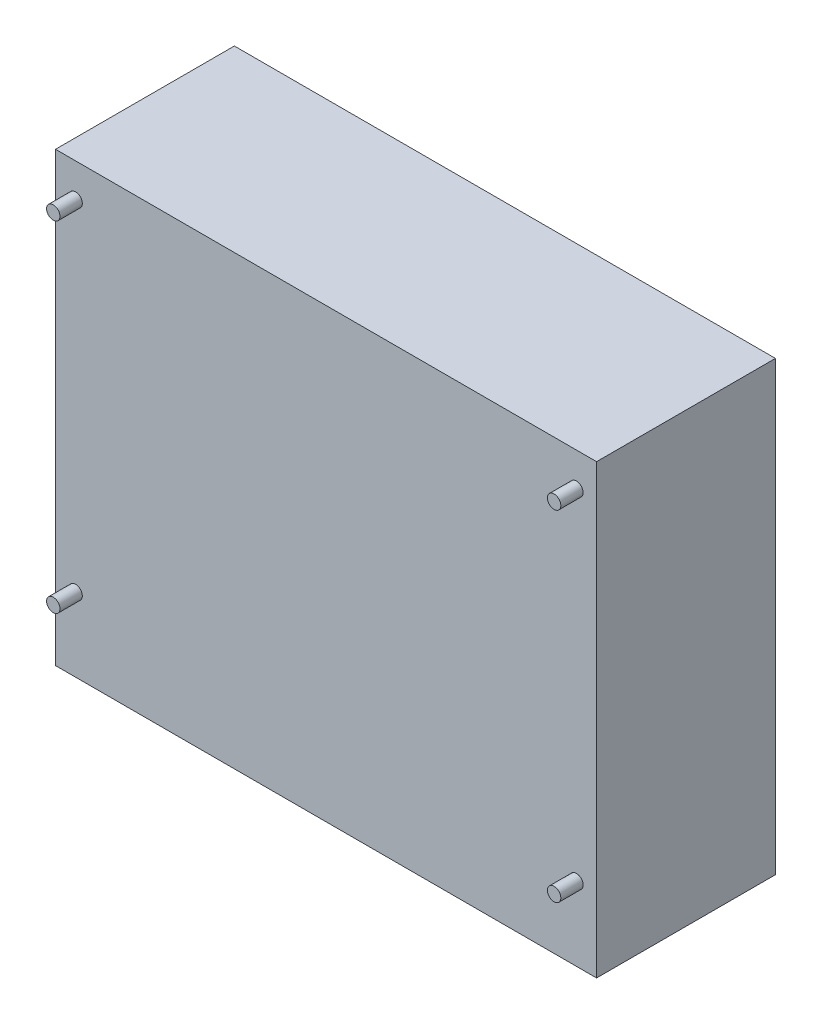
ISO-10303-21;
HEADER;
FILE_DESCRIPTION(('STEP AP214'),'2;1');
FILE_NAME('part.step','',(''),(''),'','','');
FILE_SCHEMA(('AUTOMOTIVE_DESIGN { 1 0 10303 214 1 1 1 1 }'));
ENDSEC;
DATA;
#1=APPLICATION_CONTEXT('core data for automotive mechanical design processes');
#2=APPLICATION_PROTOCOL_DEFINITION('international standard','automotive_design',2000,#1);
#3=PRODUCT_CONTEXT('',#1,'mechanical');
#4=PRODUCT('Part','Part','',(#3));
#5=PRODUCT_RELATED_PRODUCT_CATEGORY('part','',(#4));
#6=PRODUCT_DEFINITION_FORMATION('','',#4);
#7=PRODUCT_DEFINITION_CONTEXT('part definition',#1,'design');
#8=PRODUCT_DEFINITION('design','',#6,#7);
#9=PRODUCT_DEFINITION_SHAPE('','',#8);
#10=(LENGTH_UNIT() NAMED_UNIT(*) SI_UNIT(.MILLI.,.METRE.));
#11=(NAMED_UNIT(*) PLANE_ANGLE_UNIT() SI_UNIT($,.RADIAN.));
#12=(NAMED_UNIT(*) SI_UNIT($,.STERADIAN.) SOLID_ANGLE_UNIT());
#13=UNCERTAINTY_MEASURE_WITH_UNIT(LENGTH_MEASURE(1.E-05),#10,'distance_accuracy_value','');
#14=(GEOMETRIC_REPRESENTATION_CONTEXT(3) GLOBAL_UNCERTAINTY_ASSIGNED_CONTEXT((#13)) GLOBAL_UNIT_ASSIGNED_CONTEXT((#10,
#11,#12)) REPRESENTATION_CONTEXT('',''));
#15=CARTESIAN_POINT('',(0.,0.,0.));
#16=DIRECTION('',(0.,0.,1.));
#17=DIRECTION('',(1.,0.,0.));
#18=AXIS2_PLACEMENT_3D('',#15,#16,#17);
#19=CARTESIAN_POINT('',(0.,0.,40.));
#20=DIRECTION('',(-1.,0.,0.));
#21=DIRECTION('',(0.,0.,1.));
#22=AXIS2_PLACEMENT_3D('',#19,#20,#21);
#23=PLANE('',#22);
#24=DIRECTION('',(0.,1.,0.));
#25=VECTOR('',#24,1.);
#26=CARTESIAN_POINT('',(0.,0.,0.));
#27=LINE('',#26,#25);
#28=CARTESIAN_POINT('',(0.,0.,0.));
#29=VERTEX_POINT('',#28);
#30=CARTESIAN_POINT('',(0.,100.,0.));
#31=VERTEX_POINT('',#30);
#32=EDGE_CURVE('E168',#29,#31,#27,.T.);
#33=ORIENTED_EDGE('',*,*,#32,.T.);
#34=DIRECTION('',(0.,0.,-1.));
#35=VECTOR('',#34,1.);
#36=CARTESIAN_POINT('',(0.,100.,40.));
#37=LINE('',#36,#35);
#38=CARTESIAN_POINT('',(0.,100.,40.));
#39=VERTEX_POINT('',#38);
#40=EDGE_CURVE('E12',#39,#31,#37,.T.);
#41=ORIENTED_EDGE('',*,*,#40,.F.);
#42=DIRECTION('',(0.,1.,0.));
#43=VECTOR('',#42,1.);
#44=CARTESIAN_POINT('',(0.,0.,40.));
#45=LINE('',#44,#43);
#46=CARTESIAN_POINT('',(0.,0.,40.));
#47=VERTEX_POINT('',#46);
#48=EDGE_CURVE('E171',#47,#39,#45,.T.);
#49=ORIENTED_EDGE('',*,*,#48,.F.);
#50=DIRECTION('',(0.,0.,-1.));
#51=VECTOR('',#50,1.);
#52=CARTESIAN_POINT('',(0.,0.,40.));
#53=LINE('',#52,#51);
#54=EDGE_CURVE('E177',#47,#29,#53,.T.);
#55=ORIENTED_EDGE('',*,*,#54,.T.);
#56=EDGE_LOOP('',(#33,#41,#49,#55));
#57=FACE_BOUND('',#56,.T.);
#58=ADVANCED_FACE('F42',(#57),#23,.F.);
#59=CARTESIAN_POINT('',(0.,100.,40.));
#60=DIRECTION('',(0.,-1.,0.));
#61=DIRECTION('',(1.,0.,0.));
#62=AXIS2_PLACEMENT_3D('',#59,#60,#61);
#63=PLANE('',#62);
#64=DIRECTION('',(-1.,0.,0.));
#65=VECTOR('',#64,1.);
#66=CARTESIAN_POINT('',(0.,100.,0.));
#67=LINE('',#66,#65);
#68=CARTESIAN_POINT('',(-121.,100.,0.));
#69=VERTEX_POINT('',#68);
#70=EDGE_CURVE('E180',#31,#69,#67,.T.);
#71=ORIENTED_EDGE('',*,*,#70,.T.);
#72=DIRECTION('',(0.,0.,-1.));
#73=VECTOR('',#72,1.);
#74=CARTESIAN_POINT('',(-121.,100.,40.));
#75=LINE('',#74,#73);
#76=CARTESIAN_POINT('',(-121.,100.,40.));
#77=VERTEX_POINT('',#76);
#78=EDGE_CURVE('E50',#77,#69,#75,.T.);
#79=ORIENTED_EDGE('',*,*,#78,.F.);
#80=DIRECTION('',(-1.,0.,0.));
#81=VECTOR('',#80,1.);
#82=CARTESIAN_POINT('',(0.,100.,40.));
#83=LINE('',#82,#81);
#84=EDGE_CURVE('E94',#39,#77,#83,.T.);
#85=ORIENTED_EDGE('',*,*,#84,.F.);
#86=ORIENTED_EDGE('',*,*,#40,.T.);
#87=EDGE_LOOP('',(#71,#79,#85,#86));
#88=FACE_BOUND('',#87,.T.);
#89=ADVANCED_FACE('F209',(#88),#63,.F.);
#90=CARTESIAN_POINT('',(-121.,0.,40.));
#91=DIRECTION('',(1.,0.,0.));
#92=DIRECTION('',(0.,0.,-1.));
#93=AXIS2_PLACEMENT_3D('',#90,#91,#92);
#94=PLANE('',#93);
#95=DIRECTION('',(0.,-1.,0.));
#96=VECTOR('',#95,1.);
#97=CARTESIAN_POINT('',(-121.,0.,0.));
#98=LINE('',#97,#96);
#99=CARTESIAN_POINT('',(-121.,0.,0.));
#100=VERTEX_POINT('',#99);
#101=EDGE_CURVE('E182',#69,#100,#98,.T.);
#102=ORIENTED_EDGE('',*,*,#101,.T.);
#103=DIRECTION('',(0.,0.,-1.));
#104=VECTOR('',#103,1.);
#105=CARTESIAN_POINT('',(-121.,0.,40.));
#106=LINE('',#105,#104);
#107=CARTESIAN_POINT('',(-121.,0.,40.));
#108=VERTEX_POINT('',#107);
#109=EDGE_CURVE('E186',#108,#100,#106,.T.);
#110=ORIENTED_EDGE('',*,*,#109,.F.);
#111=DIRECTION('',(0.,-1.,0.));
#112=VECTOR('',#111,1.);
#113=CARTESIAN_POINT('',(-121.,0.,40.));
#114=LINE('',#113,#112);
#115=EDGE_CURVE('E174',#77,#108,#114,.T.);
#116=ORIENTED_EDGE('',*,*,#115,.F.);
#117=ORIENTED_EDGE('',*,*,#78,.T.);
#118=EDGE_LOOP('',(#102,#110,#116,#117));
#119=FACE_BOUND('',#118,.T.);
#120=ADVANCED_FACE('F191',(#119),#94,.F.);
#121=CARTESIAN_POINT('',(0.,0.,40.));
#122=DIRECTION('',(0.,1.,0.));
#123=DIRECTION('',(0.,0.,1.));
#124=AXIS2_PLACEMENT_3D('',#121,#122,#123);
#125=PLANE('',#124);
#126=DIRECTION('',(1.,0.,0.));
#127=VECTOR('',#126,1.);
#128=CARTESIAN_POINT('',(0.,0.,0.));
#129=LINE('',#128,#127);
#130=EDGE_CURVE('E87',#100,#29,#129,.T.);
#131=ORIENTED_EDGE('',*,*,#130,.T.);
#132=ORIENTED_EDGE('',*,*,#54,.F.);
#133=DIRECTION('',(1.,0.,0.));
#134=VECTOR('',#133,1.);
#135=CARTESIAN_POINT('',(0.,0.,40.));
#136=LINE('',#135,#134);
#137=EDGE_CURVE('E66',#108,#47,#136,.T.);
#138=ORIENTED_EDGE('',*,*,#137,.F.);
#139=ORIENTED_EDGE('',*,*,#109,.T.);
#140=EDGE_LOOP('',(#131,#132,#138,#139));
#141=FACE_BOUND('',#140,.T.);
#142=ADVANCED_FACE('F199',(#141),#125,.F.);
#143=CARTESIAN_POINT('',(0.,0.,40.));
#144=DIRECTION('',(0.,0.,1.));
#145=DIRECTION('',(1.,0.,0.));
#146=AXIS2_PLACEMENT_3D('',#143,#144,#145);
#147=PLANE('',#146);
#148=CARTESIAN_POINT('',(-4.49999999999999,16.5,40.));
#149=DIRECTION('',(0.,0.,1.));
#150=DIRECTION('',(1.,0.,0.));
#151=AXIS2_PLACEMENT_3D('',#148,#149,#150);
#152=CIRCLE('',#151,1.5);
#153=CARTESIAN_POINT('',(-2.99999999999999,16.5,40.));
#154=VERTEX_POINT('',#153);
#155=EDGE_CURVE('E147',#154,#154,#152,.T.);
#156=ORIENTED_EDGE('',*,*,#155,.F.);
#157=EDGE_LOOP('',(#156));
#158=FACE_BOUND('',#157,.T.);
#159=CARTESIAN_POINT('',(-116.5,16.5,40.));
#160=DIRECTION('',(0.,0.,1.));
#161=DIRECTION('',(1.,0.,0.));
#162=AXIS2_PLACEMENT_3D('',#159,#160,#161);
#163=CIRCLE('',#162,1.5);
#164=CARTESIAN_POINT('',(-115.,16.5,40.));
#165=VERTEX_POINT('',#164);
#166=EDGE_CURVE('E153',#165,#165,#163,.T.);
#167=ORIENTED_EDGE('',*,*,#166,.F.);
#168=EDGE_LOOP('',(#167));
#169=FACE_BOUND('',#168,.T.);
#170=CARTESIAN_POINT('',(-4.5,92.5,40.));
#171=DIRECTION('',(0.,0.,1.));
#172=DIRECTION('',(1.,0.,0.));
#173=AXIS2_PLACEMENT_3D('',#170,#171,#172);
#174=CIRCLE('',#173,1.5);
#175=CARTESIAN_POINT('',(-3.,92.5,40.));
#176=VERTEX_POINT('',#175);
#177=EDGE_CURVE('E159',#176,#176,#174,.T.);
#178=ORIENTED_EDGE('',*,*,#177,.F.);
#179=EDGE_LOOP('',(#178));
#180=FACE_BOUND('',#179,.T.);
#181=CARTESIAN_POINT('',(-116.5,92.5,40.));
#182=DIRECTION('',(0.,0.,1.));
#183=DIRECTION('',(1.,0.,0.));
#184=AXIS2_PLACEMENT_3D('',#181,#182,#183);
#185=CIRCLE('',#184,1.5);
#186=CARTESIAN_POINT('',(-115.,92.5,40.));
#187=VERTEX_POINT('',#186);
#188=EDGE_CURVE('E162',#187,#187,#185,.T.);
#189=ORIENTED_EDGE('',*,*,#188,.F.);
#190=EDGE_LOOP('',(#189));
#191=FACE_BOUND('',#190,.T.);
#192=ORIENTED_EDGE('',*,*,#48,.T.);
#193=ORIENTED_EDGE('',*,*,#84,.T.);
#194=ORIENTED_EDGE('',*,*,#115,.T.);
#195=ORIENTED_EDGE('',*,*,#137,.T.);
#196=EDGE_LOOP('',(#192,#193,#194,#195));
#197=FACE_BOUND('',#196,.T.);
#198=ADVANCED_FACE('F201',(#158,#169,#180,#191,#197),#147,.T.);
#199=CARTESIAN_POINT('',(0.,0.,0.));
#200=DIRECTION('',(0.,0.,1.));
#201=DIRECTION('',(1.,0.,0.));
#202=AXIS2_PLACEMENT_3D('',#199,#200,#201);
#203=PLANE('',#202);
#204=ORIENTED_EDGE('',*,*,#32,.F.);
#205=ORIENTED_EDGE('',*,*,#130,.F.);
#206=ORIENTED_EDGE('',*,*,#101,.F.);
#207=ORIENTED_EDGE('',*,*,#70,.F.);
#208=EDGE_LOOP('',(#204,#205,#206,#207));
#209=FACE_BOUND('',#208,.T.);
#210=ADVANCED_FACE('F195',(#209),#203,.F.);
#211=CARTESIAN_POINT('',(-116.5,92.5,45.));
#212=DIRECTION('',(0.,0.,-1.));
#213=DIRECTION('',(-1.,0.,0.));
#214=AXIS2_PLACEMENT_3D('',#211,#212,#213);
#215=CYLINDRICAL_SURFACE('',#214,1.5);
#216=CARTESIAN_POINT('',(-116.5,92.5,45.));
#217=DIRECTION('',(0.,0.,1.));
#218=DIRECTION('',(1.,0.,0.));
#219=AXIS2_PLACEMENT_3D('',#216,#217,#218);
#220=CIRCLE('',#219,1.5);
#221=CARTESIAN_POINT('',(-115.,92.5,45.));
#222=VERTEX_POINT('',#221);
#223=EDGE_CURVE('E165',#222,#222,#220,.T.);
#224=ORIENTED_EDGE('',*,*,#223,.F.);
#225=EDGE_LOOP('',(#224));
#226=FACE_BOUND('',#225,.T.);
#227=ORIENTED_EDGE('',*,*,#188,.T.);
#228=EDGE_LOOP('',(#227));
#229=FACE_BOUND('',#228,.T.);
#230=ADVANCED_FACE('F242',(#226,#229),#215,.T.);
#231=CARTESIAN_POINT('',(-116.5,92.5,45.));
#232=DIRECTION('',(0.,0.,1.));
#233=DIRECTION('',(1.,0.,0.));
#234=AXIS2_PLACEMENT_3D('',#231,#232,#233);
#235=PLANE('',#234);
#236=ORIENTED_EDGE('',*,*,#223,.T.);
#237=EDGE_LOOP('',(#236));
#238=FACE_BOUND('',#237,.T.);
#239=ADVANCED_FACE('F246',(#238),#235,.T.);
#240=CARTESIAN_POINT('',(-4.5,92.5,45.));
#241=DIRECTION('',(0.,0.,-1.));
#242=DIRECTION('',(-1.,0.,0.));
#243=AXIS2_PLACEMENT_3D('',#240,#241,#242);
#244=CYLINDRICAL_SURFACE('',#243,1.5);
#245=CARTESIAN_POINT('',(-4.5,92.5,45.));
#246=DIRECTION('',(0.,0.,1.));
#247=DIRECTION('',(1.,0.,0.));
#248=AXIS2_PLACEMENT_3D('',#245,#246,#247);
#249=CIRCLE('',#248,1.5);
#250=CARTESIAN_POINT('',(-3.,92.5,45.));
#251=VERTEX_POINT('',#250);
#252=EDGE_CURVE('E156',#251,#251,#249,.T.);
#253=ORIENTED_EDGE('',*,*,#252,.F.);
#254=EDGE_LOOP('',(#253));
#255=FACE_BOUND('',#254,.T.);
#256=ORIENTED_EDGE('',*,*,#177,.T.);
#257=EDGE_LOOP('',(#256));
#258=FACE_BOUND('',#257,.T.);
#259=ADVANCED_FACE('F257',(#255,#258),#244,.T.);
#260=CARTESIAN_POINT('',(-4.5,92.5,45.));
#261=DIRECTION('',(0.,0.,1.));
#262=DIRECTION('',(1.,0.,0.));
#263=AXIS2_PLACEMENT_3D('',#260,#261,#262);
#264=PLANE('',#263);
#265=ORIENTED_EDGE('',*,*,#252,.T.);
#266=EDGE_LOOP('',(#265));
#267=FACE_BOUND('',#266,.T.);
#268=ADVANCED_FACE('F268',(#267),#264,.T.);
#269=CARTESIAN_POINT('',(-116.5,16.5,45.));
#270=DIRECTION('',(0.,0.,-1.));
#271=DIRECTION('',(-1.,0.,0.));
#272=AXIS2_PLACEMENT_3D('',#269,#270,#271);
#273=CYLINDRICAL_SURFACE('',#272,1.5);
#274=CARTESIAN_POINT('',(-116.5,16.5,45.));
#275=DIRECTION('',(0.,0.,1.));
#276=DIRECTION('',(1.,0.,0.));
#277=AXIS2_PLACEMENT_3D('',#274,#275,#276);
#278=CIRCLE('',#277,1.5);
#279=CARTESIAN_POINT('',(-115.,16.5,45.));
#280=VERTEX_POINT('',#279);
#281=EDGE_CURVE('E150',#280,#280,#278,.T.);
#282=ORIENTED_EDGE('',*,*,#281,.F.);
#283=EDGE_LOOP('',(#282));
#284=FACE_BOUND('',#283,.T.);
#285=ORIENTED_EDGE('',*,*,#166,.T.);
#286=EDGE_LOOP('',(#285));
#287=FACE_BOUND('',#286,.T.);
#288=ADVANCED_FACE('F279',(#284,#287),#273,.T.);
#289=CARTESIAN_POINT('',(-116.5,16.5,45.));
#290=DIRECTION('',(0.,0.,1.));
#291=DIRECTION('',(1.,0.,0.));
#292=AXIS2_PLACEMENT_3D('',#289,#290,#291);
#293=PLANE('',#292);
#294=ORIENTED_EDGE('',*,*,#281,.T.);
#295=EDGE_LOOP('',(#294));
#296=FACE_BOUND('',#295,.T.);
#297=ADVANCED_FACE('F290',(#296),#293,.T.);
#298=CARTESIAN_POINT('',(-4.49999999999999,16.5,45.));
#299=DIRECTION('',(0.,0.,-1.));
#300=DIRECTION('',(-1.,0.,0.));
#301=AXIS2_PLACEMENT_3D('',#298,#299,#300);
#302=CYLINDRICAL_SURFACE('',#301,1.5);
#303=CARTESIAN_POINT('',(-4.49999999999999,16.5,45.));
#304=DIRECTION('',(0.,0.,1.));
#305=DIRECTION('',(1.,0.,0.));
#306=AXIS2_PLACEMENT_3D('',#303,#304,#305);
#307=CIRCLE('',#306,1.5);
#308=CARTESIAN_POINT('',(-2.99999999999999,16.5,45.));
#309=VERTEX_POINT('',#308);
#310=EDGE_CURVE('E145',#309,#309,#307,.T.);
#311=ORIENTED_EDGE('',*,*,#310,.F.);
#312=EDGE_LOOP('',(#311));
#313=FACE_BOUND('',#312,.T.);
#314=ORIENTED_EDGE('',*,*,#155,.T.);
#315=EDGE_LOOP('',(#314));
#316=FACE_BOUND('',#315,.T.);
#317=ADVANCED_FACE('F301',(#313,#316),#302,.T.);
#318=CARTESIAN_POINT('',(-4.49999999999999,16.5,45.));
#319=DIRECTION('',(0.,0.,1.));
#320=DIRECTION('',(1.,0.,0.));
#321=AXIS2_PLACEMENT_3D('',#318,#319,#320);
#322=PLANE('',#321);
#323=ORIENTED_EDGE('',*,*,#310,.T.);
#324=EDGE_LOOP('',(#323));
#325=FACE_BOUND('',#324,.T.);
#326=ADVANCED_FACE('F312',(#325),#322,.T.);
#327=CLOSED_SHELL('',(#58,#89,#120,#142,#198,#210,#230,#239,#259,#268,#288,#297,#317,#326));
#328=CARTESIAN_POINT('',(0.,0.,38.));
#329=DIRECTION('',(0.,0.,1.));
#330=DIRECTION('',(1.,0.,0.));
#331=AXIS2_PLACEMENT_3D('',#328,#329,#330);
#332=PLANE('',#331);
#333=DIRECTION('',(0.,-1.,0.));
#334=VECTOR('',#333,1.);
#335=CARTESIAN_POINT('',(-2.,2.,38.));
#336=LINE('',#335,#334);
#337=CARTESIAN_POINT('',(-2.,98.,38.));
#338=VERTEX_POINT('',#337);
#339=CARTESIAN_POINT('',(-2.,2.,38.));
#340=VERTEX_POINT('',#339);
#341=EDGE_CURVE('E146',#338,#340,#336,.T.);
#342=ORIENTED_EDGE('',*,*,#341,.T.);
#343=DIRECTION('',(-1.,0.,0.));
#344=VECTOR('',#343,1.);
#345=CARTESIAN_POINT('',(-119.,2.,38.));
#346=LINE('',#345,#344);
#347=CARTESIAN_POINT('',(-119.,2.,38.));
#348=VERTEX_POINT('',#347);
#349=EDGE_CURVE('E136',#340,#348,#346,.T.);
#350=ORIENTED_EDGE('',*,*,#349,.T.);
#351=DIRECTION('',(0.,1.,0.));
#352=VECTOR('',#351,1.);
#353=CARTESIAN_POINT('',(-119.,2.,38.));
#354=LINE('',#353,#352);
#355=CARTESIAN_POINT('',(-119.,98.,38.));
#356=VERTEX_POINT('',#355);
#357=EDGE_CURVE('E135',#348,#356,#354,.T.);
#358=ORIENTED_EDGE('',*,*,#357,.T.);
#359=DIRECTION('',(1.,0.,0.));
#360=VECTOR('',#359,1.);
#361=CARTESIAN_POINT('',(-119.,98.,38.));
#362=LINE('',#361,#360);
#363=EDGE_CURVE('E430',#356,#338,#362,.T.);
#364=ORIENTED_EDGE('',*,*,#363,.T.);
#365=EDGE_LOOP('',(#342,#350,#358,#364));
#366=FACE_BOUND('',#365,.T.);
#367=ADVANCED_FACE('F331',(#366),#332,.F.);
#368=CARTESIAN_POINT('',(-2.,2.,191.343979067553));
#369=DIRECTION('',(1.,0.,0.));
#370=DIRECTION('',(0.,0.,-1.));
#371=AXIS2_PLACEMENT_3D('',#368,#369,#370);
#372=PLANE('',#371);
#373=DIRECTION('',(0.,0.,-1.));
#374=VECTOR('',#373,1.);
#375=CARTESIAN_POINT('',(-2.,98.,191.343979067553));
#376=LINE('',#375,#374);
#377=CARTESIAN_POINT('',(-2.,98.,2.));
#378=VERTEX_POINT('',#377);
#379=EDGE_CURVE('E431',#338,#378,#376,.T.);
#380=ORIENTED_EDGE('',*,*,#379,.T.);
#381=DIRECTION('',(0.,-1.,0.));
#382=VECTOR('',#381,1.);
#383=CARTESIAN_POINT('',(-2.,2.,2.));
#384=LINE('',#383,#382);
#385=CARTESIAN_POINT('',(-2.,2.,2.));
#386=VERTEX_POINT('',#385);
#387=EDGE_CURVE('E131',#378,#386,#384,.T.);
#388=ORIENTED_EDGE('',*,*,#387,.T.);
#389=DIRECTION('',(0.,0.,-1.));
#390=VECTOR('',#389,1.);
#391=CARTESIAN_POINT('',(-2.,2.,191.343979067553));
#392=LINE('',#391,#390);
#393=EDGE_CURVE('E130',#340,#386,#392,.T.);
#394=ORIENTED_EDGE('',*,*,#393,.F.);
#395=ORIENTED_EDGE('',*,*,#341,.F.);
#396=EDGE_LOOP('',(#380,#388,#394,#395));
#397=FACE_BOUND('',#396,.T.);
#398=ADVANCED_FACE('F334',(#397),#372,.F.);
#399=CARTESIAN_POINT('',(-119.,98.,191.343979067553));
#400=DIRECTION('',(0.,1.,0.));
#401=DIRECTION('',(0.,0.,1.));
#402=AXIS2_PLACEMENT_3D('',#399,#400,#401);
#403=PLANE('',#402);
#404=DIRECTION('',(0.,0.,-1.));
#405=VECTOR('',#404,1.);
#406=CARTESIAN_POINT('',(-119.,98.,191.343979067553));
#407=LINE('',#406,#405);
#408=CARTESIAN_POINT('',(-119.,98.,2.));
#409=VERTEX_POINT('',#408);
#410=EDGE_CURVE('E138',#356,#409,#407,.T.);
#411=ORIENTED_EDGE('',*,*,#410,.T.);
#412=DIRECTION('',(1.,0.,0.));
#413=VECTOR('',#412,1.);
#414=CARTESIAN_POINT('',(-2.,98.,2.));
#415=LINE('',#414,#413);
#416=EDGE_CURVE('E117',#409,#378,#415,.T.);
#417=ORIENTED_EDGE('',*,*,#416,.T.);
#418=ORIENTED_EDGE('',*,*,#379,.F.);
#419=ORIENTED_EDGE('',*,*,#363,.F.);
#420=EDGE_LOOP('',(#411,#417,#418,#419));
#421=FACE_BOUND('',#420,.T.);
#422=ADVANCED_FACE('F357',(#421),#403,.F.);
#423=CARTESIAN_POINT('',(-119.,2.,191.343979067553));
#424=DIRECTION('',(-1.,0.,0.));
#425=DIRECTION('',(0.,0.,1.));
#426=AXIS2_PLACEMENT_3D('',#423,#424,#425);
#427=PLANE('',#426);
#428=DIRECTION('',(0.,0.,-1.));
#429=VECTOR('',#428,1.);
#430=CARTESIAN_POINT('',(-119.,2.,191.343979067553));
#431=LINE('',#430,#429);
#432=CARTESIAN_POINT('',(-119.,2.,2.));
#433=VERTEX_POINT('',#432);
#434=EDGE_CURVE('E127',#348,#433,#431,.T.);
#435=ORIENTED_EDGE('',*,*,#434,.T.);
#436=DIRECTION('',(0.,1.,0.));
#437=VECTOR('',#436,1.);
#438=CARTESIAN_POINT('',(-119.,2.,2.));
#439=LINE('',#438,#437);
#440=EDGE_CURVE('E114',#433,#409,#439,.T.);
#441=ORIENTED_EDGE('',*,*,#440,.T.);
#442=ORIENTED_EDGE('',*,*,#410,.F.);
#443=ORIENTED_EDGE('',*,*,#357,.F.);
#444=EDGE_LOOP('',(#435,#441,#442,#443));
#445=FACE_BOUND('',#444,.T.);
#446=ADVANCED_FACE('F133',(#445),#427,.F.);
#447=CARTESIAN_POINT('',(-119.,2.,191.343979067553));
#448=DIRECTION('',(0.,-1.,0.));
#449=DIRECTION('',(0.,0.,-1.));
#450=AXIS2_PLACEMENT_3D('',#447,#448,#449);
#451=PLANE('',#450);
#452=ORIENTED_EDGE('',*,*,#393,.T.);
#453=DIRECTION('',(-1.,0.,0.));
#454=VECTOR('',#453,1.);
#455=CARTESIAN_POINT('',(-2.,2.,2.));
#456=LINE('',#455,#454);
#457=EDGE_CURVE('E57',#386,#433,#456,.T.);
#458=ORIENTED_EDGE('',*,*,#457,.T.);
#459=ORIENTED_EDGE('',*,*,#434,.F.);
#460=ORIENTED_EDGE('',*,*,#349,.F.);
#461=EDGE_LOOP('',(#452,#458,#459,#460));
#462=FACE_BOUND('',#461,.T.);
#463=ADVANCED_FACE('F126',(#462),#451,.F.);
#464=CARTESIAN_POINT('',(0.,0.,2.));
#465=DIRECTION('',(0.,0.,1.));
#466=DIRECTION('',(1.,0.,0.));
#467=AXIS2_PLACEMENT_3D('',#464,#465,#466);
#468=PLANE('',#467);
#469=ORIENTED_EDGE('',*,*,#387,.F.);
#470=ORIENTED_EDGE('',*,*,#416,.F.);
#471=ORIENTED_EDGE('',*,*,#440,.F.);
#472=ORIENTED_EDGE('',*,*,#457,.F.);
#473=EDGE_LOOP('',(#469,#470,#471,#472));
#474=FACE_BOUND('',#473,.T.);
#475=ADVANCED_FACE('F115',(#474),#468,.T.);
#476=CLOSED_SHELL('',(#367,#398,#422,#446,#463,#475));
#477=ORIENTED_CLOSED_SHELL('',*,#476,.T.);
#478=BREP_WITH_VOIDS('B2',#327,(#477));
#479=ADVANCED_BREP_SHAPE_REPRESENTATION('',(#18,#478),#14);
#480=SHAPE_DEFINITION_REPRESENTATION(#9,#479);
ENDSEC;
END-ISO-10303-21;
